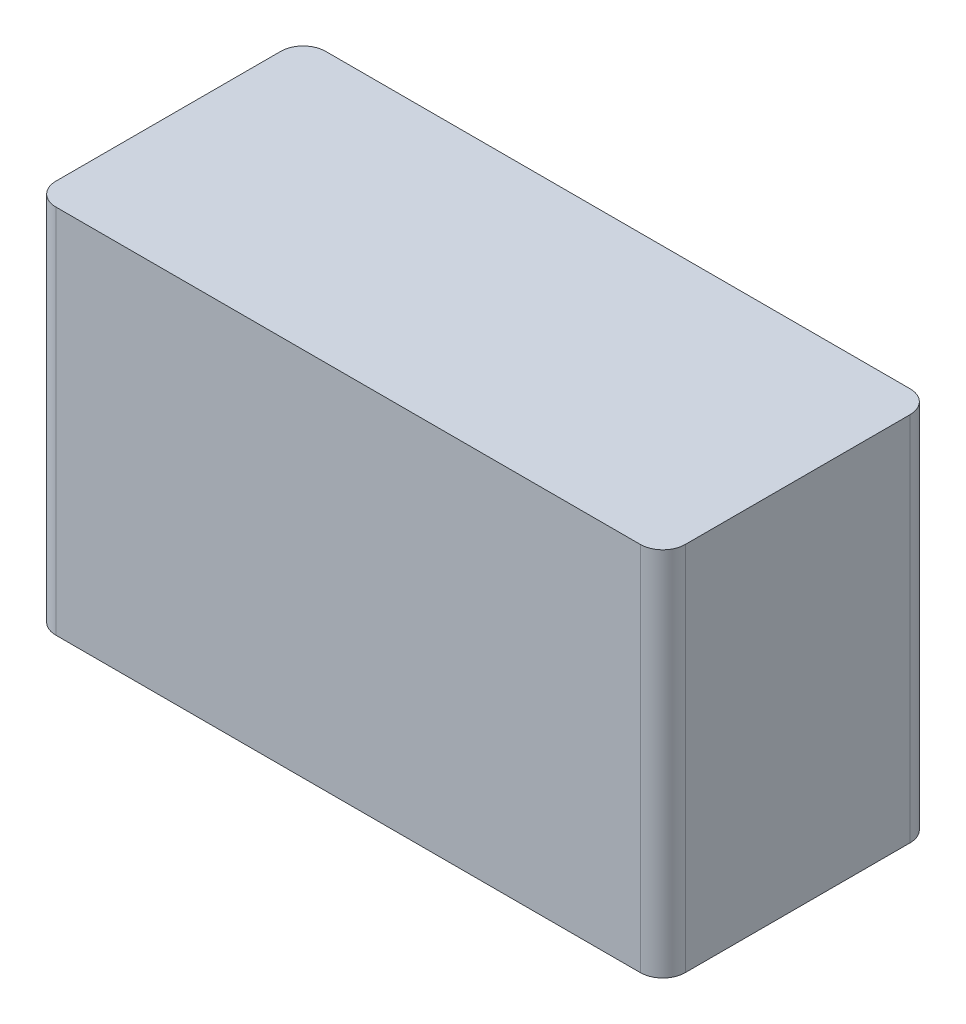
ISO-10303-21;
HEADER;
FILE_DESCRIPTION(('STEP AP214'),'2;1');
FILE_NAME('part.step','',(''),(''),'','','');
FILE_SCHEMA(('AUTOMOTIVE_DESIGN { 1 0 10303 214 1 1 1 1 }'));
ENDSEC;
DATA;
#1=APPLICATION_CONTEXT('core data for automotive mechanical design processes');
#2=APPLICATION_PROTOCOL_DEFINITION('international standard','automotive_design',2000,#1);
#3=PRODUCT_CONTEXT('',#1,'mechanical');
#4=PRODUCT('Part','Part','',(#3));
#5=PRODUCT_RELATED_PRODUCT_CATEGORY('part','',(#4));
#6=PRODUCT_DEFINITION_FORMATION('','',#4);
#7=PRODUCT_DEFINITION_CONTEXT('part definition',#1,'design');
#8=PRODUCT_DEFINITION('design','',#6,#7);
#9=PRODUCT_DEFINITION_SHAPE('','',#8);
#10=(LENGTH_UNIT() NAMED_UNIT(*) SI_UNIT(.MILLI.,.METRE.));
#11=(NAMED_UNIT(*) PLANE_ANGLE_UNIT() SI_UNIT($,.RADIAN.));
#12=(NAMED_UNIT(*) SI_UNIT($,.STERADIAN.) SOLID_ANGLE_UNIT());
#13=UNCERTAINTY_MEASURE_WITH_UNIT(LENGTH_MEASURE(1.E-05),#10,'distance_accuracy_value','');
#14=(GEOMETRIC_REPRESENTATION_CONTEXT(3) GLOBAL_UNCERTAINTY_ASSIGNED_CONTEXT((#13)) GLOBAL_UNIT_ASSIGNED_CONTEXT((#10,
#11,#12)) REPRESENTATION_CONTEXT('',''));
#15=CARTESIAN_POINT('',(0.,0.,0.));
#16=DIRECTION('',(0.,0.,1.));
#17=DIRECTION('',(1.,0.,0.));
#18=AXIS2_PLACEMENT_3D('',#15,#16,#17);
#19=CARTESIAN_POINT('',(0.,52.3875,0.));
#20=DIRECTION('',(1.,0.,0.));
#21=DIRECTION('',(0.,0.,-1.));
#22=AXIS2_PLACEMENT_3D('',#19,#20,#21);
#23=PLANE('',#22);
#24=DIRECTION('',(0.,0.,1.));
#25=VECTOR('',#24,1.);
#26=CARTESIAN_POINT('',(0.,52.3875,0.));
#27=LINE('',#26,#25);
#28=CARTESIAN_POINT('',(0.,52.3875,-34.925));
#29=VERTEX_POINT('',#28);
#30=CARTESIAN_POINT('',(0.,52.3875,-3.175));
#31=VERTEX_POINT('',#30);
#32=EDGE_CURVE('E120',#29,#31,#27,.T.);
#33=ORIENTED_EDGE('',*,*,#32,.F.);
#34=DIRECTION('',(0.,-1.,0.));
#35=VECTOR('',#34,1.);
#36=CARTESIAN_POINT('',(0.,52.3875,-34.925));
#37=LINE('',#36,#35);
#38=CARTESIAN_POINT('',(0.,0.,-34.925));
#39=VERTEX_POINT('',#38);
#40=EDGE_CURVE('E105',#29,#39,#37,.T.);
#41=ORIENTED_EDGE('',*,*,#40,.T.);
#42=DIRECTION('',(0.,0.,1.));
#43=VECTOR('',#42,1.);
#44=CARTESIAN_POINT('',(0.,0.,0.));
#45=LINE('',#44,#43);
#46=CARTESIAN_POINT('',(0.,0.,-3.175));
#47=VERTEX_POINT('',#46);
#48=EDGE_CURVE('E117',#39,#47,#45,.T.);
#49=ORIENTED_EDGE('',*,*,#48,.T.);
#50=DIRECTION('',(0.,-1.,0.));
#51=VECTOR('',#50,1.);
#52=CARTESIAN_POINT('',(0.,52.3875,-3.175));
#53=LINE('',#52,#51);
#54=EDGE_CURVE('E122',#47,#31,#53,.F.);
#55=ORIENTED_EDGE('',*,*,#54,.T.);
#56=EDGE_LOOP('',(#33,#41,#49,#55));
#57=FACE_BOUND('',#56,.T.);
#58=ADVANCED_FACE('F34',(#57),#23,.F.);
#59=CARTESIAN_POINT('',(0.,52.3875,0.));
#60=DIRECTION('',(0.,0.,-1.));
#61=DIRECTION('',(-1.,0.,0.));
#62=AXIS2_PLACEMENT_3D('',#59,#60,#61);
#63=PLANE('',#62);
#64=DIRECTION('',(1.,0.,0.));
#65=VECTOR('',#64,1.);
#66=CARTESIAN_POINT('',(0.,52.3875,0.));
#67=LINE('',#66,#65);
#68=CARTESIAN_POINT('',(3.175,52.3875,0.));
#69=VERTEX_POINT('',#68);
#70=CARTESIAN_POINT('',(85.725,52.3875,0.));
#71=VERTEX_POINT('',#70);
#72=EDGE_CURVE('E160',#69,#71,#67,.T.);
#73=ORIENTED_EDGE('',*,*,#72,.F.);
#74=DIRECTION('',(0.,-1.,0.));
#75=VECTOR('',#74,1.);
#76=CARTESIAN_POINT('',(3.175,52.3875,0.));
#77=LINE('',#76,#75);
#78=CARTESIAN_POINT('',(3.175,0.,0.));
#79=VERTEX_POINT('',#78);
#80=EDGE_CURVE('E11',#69,#79,#77,.T.);
#81=ORIENTED_EDGE('',*,*,#80,.T.);
#82=DIRECTION('',(1.,0.,0.));
#83=VECTOR('',#82,1.);
#84=CARTESIAN_POINT('',(0.,0.,0.));
#85=LINE('',#84,#83);
#86=CARTESIAN_POINT('',(85.725,0.,0.));
#87=VERTEX_POINT('',#86);
#88=EDGE_CURVE('E127',#79,#87,#85,.T.);
#89=ORIENTED_EDGE('',*,*,#88,.T.);
#90=DIRECTION('',(0.,-1.,0.));
#91=VECTOR('',#90,1.);
#92=CARTESIAN_POINT('',(85.725,52.3875,0.));
#93=LINE('',#92,#91);
#94=EDGE_CURVE('E42',#87,#71,#93,.F.);
#95=ORIENTED_EDGE('',*,*,#94,.T.);
#96=EDGE_LOOP('',(#73,#81,#89,#95));
#97=FACE_BOUND('',#96,.T.);
#98=ADVANCED_FACE('F159',(#97),#63,.F.);
#99=CARTESIAN_POINT('',(88.9,52.3875,0.));
#100=DIRECTION('',(-1.,0.,0.));
#101=DIRECTION('',(0.,0.,1.));
#102=AXIS2_PLACEMENT_3D('',#99,#100,#101);
#103=PLANE('',#102);
#104=DIRECTION('',(0.,0.,-1.));
#105=VECTOR('',#104,1.);
#106=CARTESIAN_POINT('',(88.9,0.,0.));
#107=LINE('',#106,#105);
#108=CARTESIAN_POINT('',(88.9,0.,-3.175));
#109=VERTEX_POINT('',#108);
#110=CARTESIAN_POINT('',(88.9,0.,-34.925));
#111=VERTEX_POINT('',#110);
#112=EDGE_CURVE('E130',#109,#111,#107,.T.);
#113=ORIENTED_EDGE('',*,*,#112,.T.);
#114=DIRECTION('',(0.,-1.,0.));
#115=VECTOR('',#114,1.);
#116=CARTESIAN_POINT('',(88.9,52.3875,-34.925));
#117=LINE('',#116,#115);
#118=CARTESIAN_POINT('',(88.9,52.3875,-34.925));
#119=VERTEX_POINT('',#118);
#120=EDGE_CURVE('E49',#111,#119,#117,.F.);
#121=ORIENTED_EDGE('',*,*,#120,.T.);
#122=DIRECTION('',(0.,0.,-1.));
#123=VECTOR('',#122,1.);
#124=CARTESIAN_POINT('',(88.9,52.3875,0.));
#125=LINE('',#124,#123);
#126=CARTESIAN_POINT('',(88.9,52.3875,-3.175));
#127=VERTEX_POINT('',#126);
#128=EDGE_CURVE('E166',#127,#119,#125,.T.);
#129=ORIENTED_EDGE('',*,*,#128,.F.);
#130=DIRECTION('',(0.,-1.,0.));
#131=VECTOR('',#130,1.);
#132=CARTESIAN_POINT('',(88.9,52.3875,-3.175));
#133=LINE('',#132,#131);
#134=EDGE_CURVE('E153',#127,#109,#133,.T.);
#135=ORIENTED_EDGE('',*,*,#134,.T.);
#136=EDGE_LOOP('',(#113,#121,#129,#135));
#137=FACE_BOUND('',#136,.T.);
#138=ADVANCED_FACE('F170',(#137),#103,.F.);
#139=CARTESIAN_POINT('',(0.,52.3875,-38.1));
#140=DIRECTION('',(0.,0.,1.));
#141=DIRECTION('',(1.,0.,0.));
#142=AXIS2_PLACEMENT_3D('',#139,#140,#141);
#143=PLANE('',#142);
#144=DIRECTION('',(-1.,0.,0.));
#145=VECTOR('',#144,1.);
#146=CARTESIAN_POINT('',(0.,0.,-38.1));
#147=LINE('',#146,#145);
#148=CARTESIAN_POINT('',(85.725,0.,-38.1));
#149=VERTEX_POINT('',#148);
#150=CARTESIAN_POINT('',(3.175,0.,-38.1));
#151=VERTEX_POINT('',#150);
#152=EDGE_CURVE('E137',#149,#151,#147,.T.);
#153=ORIENTED_EDGE('',*,*,#152,.T.);
#154=DIRECTION('',(0.,-1.,0.));
#155=VECTOR('',#154,1.);
#156=CARTESIAN_POINT('',(3.175,52.3875,-38.1));
#157=LINE('',#156,#155);
#158=CARTESIAN_POINT('',(3.175,52.3875,-38.1));
#159=VERTEX_POINT('',#158);
#160=EDGE_CURVE('E106',#151,#159,#157,.F.);
#161=ORIENTED_EDGE('',*,*,#160,.T.);
#162=DIRECTION('',(-1.,0.,0.));
#163=VECTOR('',#162,1.);
#164=CARTESIAN_POINT('',(0.,52.3875,-38.1));
#165=LINE('',#164,#163);
#166=CARTESIAN_POINT('',(85.725,52.3875,-38.1));
#167=VERTEX_POINT('',#166);
#168=EDGE_CURVE('E133',#167,#159,#165,.T.);
#169=ORIENTED_EDGE('',*,*,#168,.F.);
#170=DIRECTION('',(0.,-1.,0.));
#171=VECTOR('',#170,1.);
#172=CARTESIAN_POINT('',(85.725,52.3875,-38.1));
#173=LINE('',#172,#171);
#174=EDGE_CURVE('E111',#167,#149,#173,.T.);
#175=ORIENTED_EDGE('',*,*,#174,.T.);
#176=EDGE_LOOP('',(#153,#161,#169,#175));
#177=FACE_BOUND('',#176,.T.);
#178=ADVANCED_FACE('F177',(#177),#143,.F.);
#179=CARTESIAN_POINT('',(0.,52.3875,0.));
#180=DIRECTION('',(0.,-1.,0.));
#181=DIRECTION('',(0.,0.,-1.));
#182=AXIS2_PLACEMENT_3D('',#179,#180,#181);
#183=PLANE('',#182);
#184=ORIENTED_EDGE('',*,*,#168,.T.);
#185=CARTESIAN_POINT('',(3.175,52.3875,-34.925));
#186=DIRECTION('',(0.,-1.,0.));
#187=DIRECTION('',(0.,0.,-1.));
#188=AXIS2_PLACEMENT_3D('',#185,#186,#187);
#189=CIRCLE('',#188,3.175);
#190=EDGE_CURVE('E151',#159,#29,#189,.F.);
#191=ORIENTED_EDGE('',*,*,#190,.T.);
#192=ORIENTED_EDGE('',*,*,#32,.T.);
#193=CARTESIAN_POINT('',(3.175,52.3875,-3.175));
#194=DIRECTION('',(0.,-1.,0.));
#195=DIRECTION('',(0.,0.,-1.));
#196=AXIS2_PLACEMENT_3D('',#193,#194,#195);
#197=CIRCLE('',#196,3.175);
#198=EDGE_CURVE('E147',#31,#69,#197,.F.);
#199=ORIENTED_EDGE('',*,*,#198,.T.);
#200=ORIENTED_EDGE('',*,*,#72,.T.);
#201=CARTESIAN_POINT('',(85.725,52.3875,-3.175));
#202=DIRECTION('',(0.,-1.,0.));
#203=DIRECTION('',(0.,0.,-1.));
#204=AXIS2_PLACEMENT_3D('',#201,#202,#203);
#205=CIRCLE('',#204,3.175);
#206=EDGE_CURVE('E56',#71,#127,#205,.F.);
#207=ORIENTED_EDGE('',*,*,#206,.T.);
#208=ORIENTED_EDGE('',*,*,#128,.T.);
#209=CARTESIAN_POINT('',(85.725,52.3875,-34.925));
#210=DIRECTION('',(0.,-1.,0.));
#211=DIRECTION('',(0.,0.,-1.));
#212=AXIS2_PLACEMENT_3D('',#209,#210,#211);
#213=CIRCLE('',#212,3.175);
#214=EDGE_CURVE('E149',#119,#167,#213,.F.);
#215=ORIENTED_EDGE('',*,*,#214,.T.);
#216=EDGE_LOOP('',(#184,#191,#192,#199,#200,#207,#208,#215));
#217=FACE_BOUND('',#216,.T.);
#218=ADVANCED_FACE('F164',(#217),#183,.F.);
#219=CARTESIAN_POINT('',(0.,0.,0.));
#220=DIRECTION('',(0.,-1.,0.));
#221=DIRECTION('',(0.,0.,-1.));
#222=AXIS2_PLACEMENT_3D('',#219,#220,#221);
#223=PLANE('',#222);
#224=ORIENTED_EDGE('',*,*,#48,.F.);
#225=CARTESIAN_POINT('',(3.175,0.,-34.925));
#226=DIRECTION('',(0.,-1.,0.));
#227=DIRECTION('',(0.,0.,-1.));
#228=AXIS2_PLACEMENT_3D('',#225,#226,#227);
#229=CIRCLE('',#228,3.175);
#230=EDGE_CURVE('E101',#39,#151,#229,.T.);
#231=ORIENTED_EDGE('',*,*,#230,.T.);
#232=ORIENTED_EDGE('',*,*,#152,.F.);
#233=CARTESIAN_POINT('',(85.725,0.,-34.925));
#234=DIRECTION('',(0.,-1.,0.));
#235=DIRECTION('',(0.,0.,-1.));
#236=AXIS2_PLACEMENT_3D('',#233,#234,#235);
#237=CIRCLE('',#236,3.175);
#238=EDGE_CURVE('E112',#149,#111,#237,.T.);
#239=ORIENTED_EDGE('',*,*,#238,.T.);
#240=ORIENTED_EDGE('',*,*,#112,.F.);
#241=CARTESIAN_POINT('',(85.725,0.,-3.175));
#242=DIRECTION('',(0.,-1.,0.));
#243=DIRECTION('',(0.,0.,-1.));
#244=AXIS2_PLACEMENT_3D('',#241,#242,#243);
#245=CIRCLE('',#244,3.175);
#246=EDGE_CURVE('E121',#109,#87,#245,.T.);
#247=ORIENTED_EDGE('',*,*,#246,.T.);
#248=ORIENTED_EDGE('',*,*,#88,.F.);
#249=CARTESIAN_POINT('',(3.175,0.,-3.175));
#250=DIRECTION('',(0.,-1.,0.));
#251=DIRECTION('',(0.,0.,-1.));
#252=AXIS2_PLACEMENT_3D('',#249,#250,#251);
#253=CIRCLE('',#252,3.175);
#254=EDGE_CURVE('E126',#79,#47,#253,.T.);
#255=ORIENTED_EDGE('',*,*,#254,.T.);
#256=EDGE_LOOP('',(#224,#231,#232,#239,#240,#247,#248,#255));
#257=FACE_BOUND('',#256,.T.);
#258=ADVANCED_FACE('F124',(#257),#223,.T.);
#259=CARTESIAN_POINT('',(3.175,52.3875,-34.925));
#260=DIRECTION('',(0.,-1.,0.));
#261=DIRECTION('',(0.,0.,-1.));
#262=AXIS2_PLACEMENT_3D('',#259,#260,#261);
#263=CYLINDRICAL_SURFACE('',#262,3.175);
#264=ORIENTED_EDGE('',*,*,#190,.F.);
#265=ORIENTED_EDGE('',*,*,#160,.F.);
#266=ORIENTED_EDGE('',*,*,#230,.F.);
#267=ORIENTED_EDGE('',*,*,#40,.F.);
#268=EDGE_LOOP('',(#264,#265,#266,#267));
#269=FACE_BOUND('',#268,.T.);
#270=ADVANCED_FACE('F104',(#269),#263,.T.);
#271=CARTESIAN_POINT('',(85.725,52.3875,-34.925));
#272=DIRECTION('',(0.,-1.,0.));
#273=DIRECTION('',(0.,0.,-1.));
#274=AXIS2_PLACEMENT_3D('',#271,#272,#273);
#275=CYLINDRICAL_SURFACE('',#274,3.175);
#276=ORIENTED_EDGE('',*,*,#214,.F.);
#277=ORIENTED_EDGE('',*,*,#120,.F.);
#278=ORIENTED_EDGE('',*,*,#238,.F.);
#279=ORIENTED_EDGE('',*,*,#174,.F.);
#280=EDGE_LOOP('',(#276,#277,#278,#279));
#281=FACE_BOUND('',#280,.T.);
#282=ADVANCED_FACE('F174',(#281),#275,.T.);
#283=CARTESIAN_POINT('',(3.175,52.3875,-3.175));
#284=DIRECTION('',(0.,-1.,0.));
#285=DIRECTION('',(0.,0.,-1.));
#286=AXIS2_PLACEMENT_3D('',#283,#284,#285);
#287=CYLINDRICAL_SURFACE('',#286,3.175);
#288=ORIENTED_EDGE('',*,*,#198,.F.);
#289=ORIENTED_EDGE('',*,*,#54,.F.);
#290=ORIENTED_EDGE('',*,*,#254,.F.);
#291=ORIENTED_EDGE('',*,*,#80,.F.);
#292=EDGE_LOOP('',(#288,#289,#290,#291));
#293=FACE_BOUND('',#292,.T.);
#294=ADVANCED_FACE('F180',(#293),#287,.T.);
#295=CARTESIAN_POINT('',(85.725,52.3875,-3.175));
#296=DIRECTION('',(0.,-1.,0.));
#297=DIRECTION('',(0.,0.,-1.));
#298=AXIS2_PLACEMENT_3D('',#295,#296,#297);
#299=CYLINDRICAL_SURFACE('',#298,3.175);
#300=ORIENTED_EDGE('',*,*,#206,.F.);
#301=ORIENTED_EDGE('',*,*,#94,.F.);
#302=ORIENTED_EDGE('',*,*,#246,.F.);
#303=ORIENTED_EDGE('',*,*,#134,.F.);
#304=EDGE_LOOP('',(#300,#301,#302,#303));
#305=FACE_BOUND('',#304,.T.);
#306=ADVANCED_FACE('F36',(#305),#299,.T.);
#307=CLOSED_SHELL('',(#58,#98,#138,#178,#218,#258,#270,#282,#294,#306));
#308=MANIFOLD_SOLID_BREP('B2',#307);
#309=ADVANCED_BREP_SHAPE_REPRESENTATION('',(#18,#308),#14);
#310=SHAPE_DEFINITION_REPRESENTATION(#9,#309);
ENDSEC;
END-ISO-10303-21;
